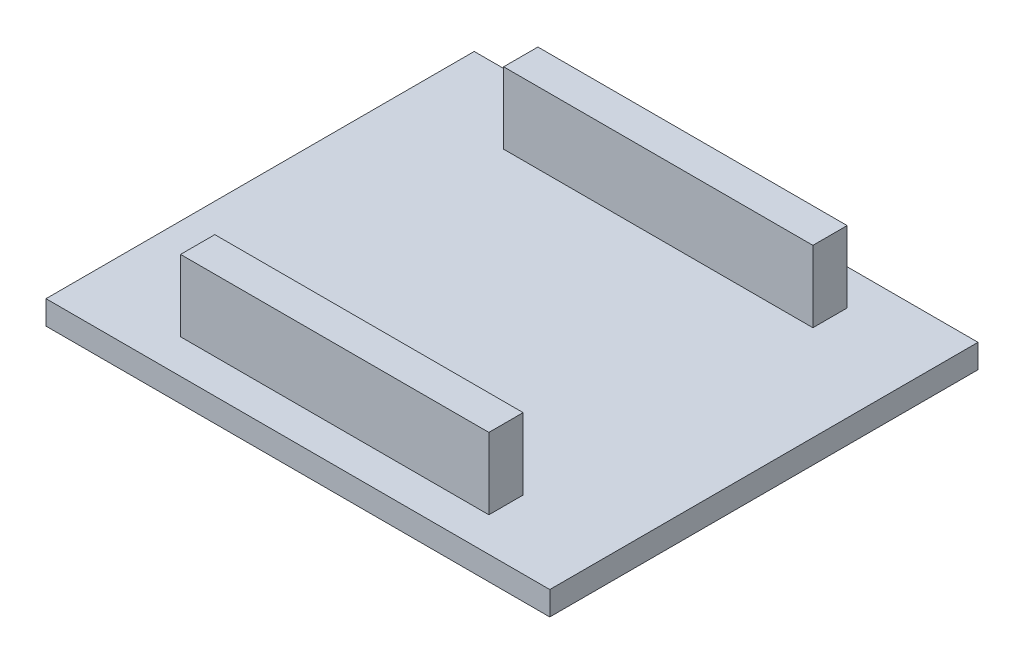
ISO-10303-21;
HEADER;
FILE_DESCRIPTION(('STEP AP214'),'2;1');
FILE_NAME('part.step','',(''),(''),'','','');
FILE_SCHEMA(('AUTOMOTIVE_DESIGN { 1 0 10303 214 1 1 1 1 }'));
ENDSEC;
DATA;
#1=APPLICATION_CONTEXT('core data for automotive mechanical design processes');
#2=APPLICATION_PROTOCOL_DEFINITION('international standard','automotive_design',2000,#1);
#3=PRODUCT_CONTEXT('',#1,'mechanical');
#4=PRODUCT('Part','Part','',(#3));
#5=PRODUCT_RELATED_PRODUCT_CATEGORY('part','',(#4));
#6=PRODUCT_DEFINITION_FORMATION('','',#4);
#7=PRODUCT_DEFINITION_CONTEXT('part definition',#1,'design');
#8=PRODUCT_DEFINITION('design','',#6,#7);
#9=PRODUCT_DEFINITION_SHAPE('','',#8);
#10=(LENGTH_UNIT() NAMED_UNIT(*) SI_UNIT(.MILLI.,.METRE.));
#11=(NAMED_UNIT(*) PLANE_ANGLE_UNIT() SI_UNIT($,.RADIAN.));
#12=(NAMED_UNIT(*) SI_UNIT($,.STERADIAN.) SOLID_ANGLE_UNIT());
#13=UNCERTAINTY_MEASURE_WITH_UNIT(LENGTH_MEASURE(1.E-05),#10,'distance_accuracy_value','');
#14=(GEOMETRIC_REPRESENTATION_CONTEXT(3) GLOBAL_UNCERTAINTY_ASSIGNED_CONTEXT((#13)) GLOBAL_UNIT_ASSIGNED_CONTEXT((#10,
#11,#12)) REPRESENTATION_CONTEXT('',''));
#15=CARTESIAN_POINT('',(0.,0.,0.));
#16=DIRECTION('',(0.,0.,1.));
#17=DIRECTION('',(1.,0.,0.));
#18=AXIS2_PLACEMENT_3D('',#15,#16,#17);
#19=CARTESIAN_POINT('',(0.,1.5875,0.));
#20=DIRECTION('',(0.,-1.,0.));
#21=DIRECTION('',(0.,0.,-1.));
#22=AXIS2_PLACEMENT_3D('',#19,#20,#21);
#23=PLANE('',#22);
#24=DIRECTION('',(0.,0.,1.));
#25=VECTOR('',#24,1.);
#26=CARTESIAN_POINT('',(6.69364701399999,1.5875,-2.286));
#27=LINE('',#26,#25);
#28=CARTESIAN_POINT('',(6.69364701399999,1.5875,-4.572));
#29=VERTEX_POINT('',#28);
#30=CARTESIAN_POINT('',(6.69364701399999,1.5875,-2.286));
#31=VERTEX_POINT('',#30);
#32=EDGE_CURVE('E148',#29,#31,#27,.T.);
#33=ORIENTED_EDGE('',*,*,#32,.F.);
#34=DIRECTION('',(-1.,0.,0.));
#35=VECTOR('',#34,1.);
#36=CARTESIAN_POINT('',(6.69364701399999,1.5875,-4.572));
#37=LINE('',#36,#35);
#38=CARTESIAN_POINT('',(27.267647014,1.5875,-4.572));
#39=VERTEX_POINT('',#38);
#40=EDGE_CURVE('E161',#39,#29,#37,.T.);
#41=ORIENTED_EDGE('',*,*,#40,.F.);
#42=DIRECTION('',(0.,0.,-1.));
#43=VECTOR('',#42,1.);
#44=CARTESIAN_POINT('',(27.267647014,1.5875,-2.286));
#45=LINE('',#44,#43);
#46=CARTESIAN_POINT('',(27.267647014,1.5875,-2.286));
#47=VERTEX_POINT('',#46);
#48=EDGE_CURVE('E170',#47,#39,#45,.T.);
#49=ORIENTED_EDGE('',*,*,#48,.F.);
#50=DIRECTION('',(1.,0.,0.));
#51=VECTOR('',#50,1.);
#52=CARTESIAN_POINT('',(6.69364701399999,1.5875,-2.286));
#53=LINE('',#52,#51);
#54=EDGE_CURVE('E151',#31,#47,#53,.T.);
#55=ORIENTED_EDGE('',*,*,#54,.F.);
#56=EDGE_LOOP('',(#33,#41,#49,#55));
#57=FACE_BOUND('',#56,.T.);
#58=DIRECTION('',(0.,0.,1.));
#59=VECTOR('',#58,1.);
#60=CARTESIAN_POINT('',(0.,1.5875,0.));
#61=LINE('',#60,#59);
#62=CARTESIAN_POINT('',(0.,1.5875,-28.575));
#63=VERTEX_POINT('',#62);
#64=CARTESIAN_POINT('',(0.,1.5875,0.));
#65=VERTEX_POINT('',#64);
#66=EDGE_CURVE('E187',#63,#65,#61,.T.);
#67=ORIENTED_EDGE('',*,*,#66,.T.);
#68=DIRECTION('',(1.,0.,0.));
#69=VECTOR('',#68,1.);
#70=CARTESIAN_POINT('',(0.,1.5875,0.));
#71=LINE('',#70,#69);
#72=CARTESIAN_POINT('',(33.617647014,1.5875,0.));
#73=VERTEX_POINT('',#72);
#74=EDGE_CURVE('E190',#65,#73,#71,.T.);
#75=ORIENTED_EDGE('',*,*,#74,.T.);
#76=DIRECTION('',(0.,0.,-1.));
#77=VECTOR('',#76,1.);
#78=CARTESIAN_POINT('',(33.617647014,1.5875,0.));
#79=LINE('',#78,#77);
#80=CARTESIAN_POINT('',(33.617647014,1.5875,-28.575));
#81=VERTEX_POINT('',#80);
#82=EDGE_CURVE('E193',#73,#81,#79,.T.);
#83=ORIENTED_EDGE('',*,*,#82,.T.);
#84=DIRECTION('',(-1.,0.,0.));
#85=VECTOR('',#84,1.);
#86=CARTESIAN_POINT('',(0.,1.5875,-28.575));
#87=LINE('',#86,#85);
#88=EDGE_CURVE('E195',#81,#63,#87,.T.);
#89=ORIENTED_EDGE('',*,*,#88,.T.);
#90=EDGE_LOOP('',(#67,#75,#83,#89));
#91=FACE_BOUND('',#90,.T.);
#92=DIRECTION('',(0.,0.,1.));
#93=VECTOR('',#92,1.);
#94=CARTESIAN_POINT('',(6.63014701399999,1.5875,-23.90775));
#95=LINE('',#94,#93);
#96=CARTESIAN_POINT('',(6.63014701399999,1.5875,-26.19375));
#97=VERTEX_POINT('',#96);
#98=CARTESIAN_POINT('',(6.63014701399999,1.5875,-23.90775));
#99=VERTEX_POINT('',#98);
#100=EDGE_CURVE('E147',#97,#99,#95,.T.);
#101=ORIENTED_EDGE('',*,*,#100,.F.);
#102=DIRECTION('',(-1.,0.,0.));
#103=VECTOR('',#102,1.);
#104=CARTESIAN_POINT('',(6.63014701399999,1.5875,-26.19375));
#105=LINE('',#104,#103);
#106=CARTESIAN_POINT('',(27.267647014,1.5875,-26.19375));
#107=VERTEX_POINT('',#106);
#108=EDGE_CURVE('E144',#107,#97,#105,.T.);
#109=ORIENTED_EDGE('',*,*,#108,.F.);
#110=DIRECTION('',(0.,0.,-1.));
#111=VECTOR('',#110,1.);
#112=CARTESIAN_POINT('',(27.267647014,1.5875,-23.90775));
#113=LINE('',#112,#111);
#114=CARTESIAN_POINT('',(27.267647014,1.5875,-23.90775));
#115=VERTEX_POINT('',#114);
#116=EDGE_CURVE('E58',#115,#107,#113,.T.);
#117=ORIENTED_EDGE('',*,*,#116,.F.);
#118=DIRECTION('',(1.,0.,0.));
#119=VECTOR('',#118,1.);
#120=CARTESIAN_POINT('',(6.63014701399999,1.5875,-23.90775));
#121=LINE('',#120,#119);
#122=EDGE_CURVE('E53',#99,#115,#121,.T.);
#123=ORIENTED_EDGE('',*,*,#122,.F.);
#124=EDGE_LOOP('',(#101,#109,#117,#123));
#125=FACE_BOUND('',#124,.T.);
#126=ADVANCED_FACE('F38',(#57,#91,#125),#23,.F.);
#127=CARTESIAN_POINT('',(0.,1.5875,0.));
#128=DIRECTION('',(1.,0.,0.));
#129=DIRECTION('',(0.,0.,-1.));
#130=AXIS2_PLACEMENT_3D('',#127,#128,#129);
#131=PLANE('',#130);
#132=DIRECTION('',(0.,0.,1.));
#133=VECTOR('',#132,1.);
#134=CARTESIAN_POINT('',(0.,0.,0.));
#135=LINE('',#134,#133);
#136=CARTESIAN_POINT('',(0.,0.,-28.575));
#137=VERTEX_POINT('',#136);
#138=CARTESIAN_POINT('',(0.,0.,0.));
#139=VERTEX_POINT('',#138);
#140=EDGE_CURVE('E186',#137,#139,#135,.T.);
#141=ORIENTED_EDGE('',*,*,#140,.T.);
#142=DIRECTION('',(0.,-1.,0.));
#143=VECTOR('',#142,1.);
#144=CARTESIAN_POINT('',(0.,1.5875,0.));
#145=LINE('',#144,#143);
#146=EDGE_CURVE('E11',#65,#139,#145,.T.);
#147=ORIENTED_EDGE('',*,*,#146,.F.);
#148=ORIENTED_EDGE('',*,*,#66,.F.);
#149=DIRECTION('',(0.,-1.,0.));
#150=VECTOR('',#149,1.);
#151=CARTESIAN_POINT('',(0.,1.5875,-28.575));
#152=LINE('',#151,#150);
#153=EDGE_CURVE('E197',#63,#137,#152,.T.);
#154=ORIENTED_EDGE('',*,*,#153,.T.);
#155=EDGE_LOOP('',(#141,#147,#148,#154));
#156=FACE_BOUND('',#155,.T.);
#157=ADVANCED_FACE('F40',(#156),#131,.F.);
#158=CARTESIAN_POINT('',(0.,1.5875,0.));
#159=DIRECTION('',(0.,0.,-1.));
#160=DIRECTION('',(-1.,0.,0.));
#161=AXIS2_PLACEMENT_3D('',#158,#159,#160);
#162=PLANE('',#161);
#163=DIRECTION('',(1.,0.,0.));
#164=VECTOR('',#163,1.);
#165=CARTESIAN_POINT('',(0.,0.,0.));
#166=LINE('',#165,#164);
#167=CARTESIAN_POINT('',(33.617647014,0.,0.));
#168=VERTEX_POINT('',#167);
#169=EDGE_CURVE('E200',#139,#168,#166,.T.);
#170=ORIENTED_EDGE('',*,*,#169,.T.);
#171=DIRECTION('',(0.,-1.,0.));
#172=VECTOR('',#171,1.);
#173=CARTESIAN_POINT('',(33.617647014,1.5875,0.));
#174=LINE('',#173,#172);
#175=EDGE_CURVE('E46',#73,#168,#174,.T.);
#176=ORIENTED_EDGE('',*,*,#175,.F.);
#177=ORIENTED_EDGE('',*,*,#74,.F.);
#178=ORIENTED_EDGE('',*,*,#146,.T.);
#179=EDGE_LOOP('',(#170,#176,#177,#178));
#180=FACE_BOUND('',#179,.T.);
#181=ADVANCED_FACE('F229',(#180),#162,.F.);
#182=CARTESIAN_POINT('',(33.617647014,1.5875,0.));
#183=DIRECTION('',(-1.,0.,0.));
#184=DIRECTION('',(0.,0.,1.));
#185=AXIS2_PLACEMENT_3D('',#182,#183,#184);
#186=PLANE('',#185);
#187=DIRECTION('',(0.,0.,-1.));
#188=VECTOR('',#187,1.);
#189=CARTESIAN_POINT('',(33.617647014,0.,0.));
#190=LINE('',#189,#188);
#191=CARTESIAN_POINT('',(33.617647014,0.,-28.575));
#192=VERTEX_POINT('',#191);
#193=EDGE_CURVE('E202',#168,#192,#190,.T.);
#194=ORIENTED_EDGE('',*,*,#193,.T.);
#195=DIRECTION('',(0.,-1.,0.));
#196=VECTOR('',#195,1.);
#197=CARTESIAN_POINT('',(33.617647014,1.5875,-28.575));
#198=LINE('',#197,#196);
#199=EDGE_CURVE('E207',#81,#192,#198,.T.);
#200=ORIENTED_EDGE('',*,*,#199,.F.);
#201=ORIENTED_EDGE('',*,*,#82,.F.);
#202=ORIENTED_EDGE('',*,*,#175,.T.);
#203=EDGE_LOOP('',(#194,#200,#201,#202));
#204=FACE_BOUND('',#203,.T.);
#205=ADVANCED_FACE('F214',(#204),#186,.F.);
#206=CARTESIAN_POINT('',(0.,1.5875,-28.575));
#207=DIRECTION('',(0.,0.,1.));
#208=DIRECTION('',(1.,0.,0.));
#209=AXIS2_PLACEMENT_3D('',#206,#207,#208);
#210=PLANE('',#209);
#211=DIRECTION('',(-1.,0.,0.));
#212=VECTOR('',#211,1.);
#213=CARTESIAN_POINT('',(0.,0.,-28.575));
#214=LINE('',#213,#212);
#215=EDGE_CURVE('E191',#192,#137,#214,.T.);
#216=ORIENTED_EDGE('',*,*,#215,.T.);
#217=ORIENTED_EDGE('',*,*,#153,.F.);
#218=ORIENTED_EDGE('',*,*,#88,.F.);
#219=ORIENTED_EDGE('',*,*,#199,.T.);
#220=EDGE_LOOP('',(#216,#217,#218,#219));
#221=FACE_BOUND('',#220,.T.);
#222=ADVANCED_FACE('F223',(#221),#210,.F.);
#223=CARTESIAN_POINT('',(0.,0.,0.));
#224=DIRECTION('',(0.,-1.,0.));
#225=DIRECTION('',(0.,0.,-1.));
#226=AXIS2_PLACEMENT_3D('',#223,#224,#225);
#227=PLANE('',#226);
#228=ORIENTED_EDGE('',*,*,#140,.F.);
#229=ORIENTED_EDGE('',*,*,#215,.F.);
#230=ORIENTED_EDGE('',*,*,#193,.F.);
#231=ORIENTED_EDGE('',*,*,#169,.F.);
#232=EDGE_LOOP('',(#228,#229,#230,#231));
#233=FACE_BOUND('',#232,.T.);
#234=ADVANCED_FACE('F220',(#233),#227,.T.);
#235=CARTESIAN_POINT('',(6.69364701399999,6.35,-2.286));
#236=DIRECTION('',(1.,0.,0.));
#237=DIRECTION('',(0.,0.,-1.));
#238=AXIS2_PLACEMENT_3D('',#235,#236,#237);
#239=PLANE('',#238);
#240=ORIENTED_EDGE('',*,*,#32,.T.);
#241=DIRECTION('',(0.,-1.,0.));
#242=VECTOR('',#241,1.);
#243=CARTESIAN_POINT('',(6.69364701399999,6.35,-2.286));
#244=LINE('',#243,#242);
#245=CARTESIAN_POINT('',(6.69364701399999,6.35,-2.286));
#246=VERTEX_POINT('',#245);
#247=EDGE_CURVE('E183',#246,#31,#244,.T.);
#248=ORIENTED_EDGE('',*,*,#247,.F.);
#249=DIRECTION('',(0.,0.,1.));
#250=VECTOR('',#249,1.);
#251=CARTESIAN_POINT('',(6.69364701399999,6.35,-2.286));
#252=LINE('',#251,#250);
#253=CARTESIAN_POINT('',(6.69364701399999,6.35,-4.572));
#254=VERTEX_POINT('',#253);
#255=EDGE_CURVE('E157',#254,#246,#252,.T.);
#256=ORIENTED_EDGE('',*,*,#255,.F.);
#257=DIRECTION('',(0.,-1.,0.));
#258=VECTOR('',#257,1.);
#259=CARTESIAN_POINT('',(6.69364701399999,6.35,-4.572));
#260=LINE('',#259,#258);
#261=EDGE_CURVE('E166',#254,#29,#260,.T.);
#262=ORIENTED_EDGE('',*,*,#261,.T.);
#263=EDGE_LOOP('',(#240,#248,#256,#262));
#264=FACE_BOUND('',#263,.T.);
#265=ADVANCED_FACE('F243',(#264),#239,.F.);
#266=CARTESIAN_POINT('',(6.69364701399999,6.35,-2.286));
#267=DIRECTION('',(0.,0.,-1.));
#268=DIRECTION('',(-1.,0.,0.));
#269=AXIS2_PLACEMENT_3D('',#266,#267,#268);
#270=PLANE('',#269);
#271=ORIENTED_EDGE('',*,*,#54,.T.);
#272=DIRECTION('',(0.,-1.,0.));
#273=VECTOR('',#272,1.);
#274=CARTESIAN_POINT('',(27.267647014,6.35,-2.286));
#275=LINE('',#274,#273);
#276=CARTESIAN_POINT('',(27.267647014,6.35,-2.286));
#277=VERTEX_POINT('',#276);
#278=EDGE_CURVE('E180',#277,#47,#275,.T.);
#279=ORIENTED_EDGE('',*,*,#278,.F.);
#280=DIRECTION('',(1.,0.,0.));
#281=VECTOR('',#280,1.);
#282=CARTESIAN_POINT('',(6.69364701399999,6.35,-2.286));
#283=LINE('',#282,#281);
#284=EDGE_CURVE('E160',#246,#277,#283,.T.);
#285=ORIENTED_EDGE('',*,*,#284,.F.);
#286=ORIENTED_EDGE('',*,*,#247,.T.);
#287=EDGE_LOOP('',(#271,#279,#285,#286));
#288=FACE_BOUND('',#287,.T.);
#289=ADVANCED_FACE('F262',(#288),#270,.F.);
#290=CARTESIAN_POINT('',(27.267647014,6.35,-2.286));
#291=DIRECTION('',(-1.,0.,0.));
#292=DIRECTION('',(0.,0.,1.));
#293=AXIS2_PLACEMENT_3D('',#290,#291,#292);
#294=PLANE('',#293);
#295=ORIENTED_EDGE('',*,*,#48,.T.);
#296=DIRECTION('',(0.,-1.,0.));
#297=VECTOR('',#296,1.);
#298=CARTESIAN_POINT('',(27.267647014,6.35,-4.572));
#299=LINE('',#298,#297);
#300=CARTESIAN_POINT('',(27.267647014,6.35,-4.572));
#301=VERTEX_POINT('',#300);
#302=EDGE_CURVE('E177',#301,#39,#299,.T.);
#303=ORIENTED_EDGE('',*,*,#302,.F.);
#304=DIRECTION('',(0.,0.,-1.));
#305=VECTOR('',#304,1.);
#306=CARTESIAN_POINT('',(27.267647014,6.35,-2.286));
#307=LINE('',#306,#305);
#308=EDGE_CURVE('E163',#277,#301,#307,.T.);
#309=ORIENTED_EDGE('',*,*,#308,.F.);
#310=ORIENTED_EDGE('',*,*,#278,.T.);
#311=EDGE_LOOP('',(#295,#303,#309,#310));
#312=FACE_BOUND('',#311,.T.);
#313=ADVANCED_FACE('F269',(#312),#294,.F.);
#314=CARTESIAN_POINT('',(6.69364701399999,6.35,-4.572));
#315=DIRECTION('',(0.,0.,1.));
#316=DIRECTION('',(1.,0.,0.));
#317=AXIS2_PLACEMENT_3D('',#314,#315,#316);
#318=PLANE('',#317);
#319=ORIENTED_EDGE('',*,*,#40,.T.);
#320=ORIENTED_EDGE('',*,*,#261,.F.);
#321=DIRECTION('',(-1.,0.,0.));
#322=VECTOR('',#321,1.);
#323=CARTESIAN_POINT('',(6.69364701399999,6.35,-4.572));
#324=LINE('',#323,#322);
#325=EDGE_CURVE('E165',#301,#254,#324,.T.);
#326=ORIENTED_EDGE('',*,*,#325,.F.);
#327=ORIENTED_EDGE('',*,*,#302,.T.);
#328=EDGE_LOOP('',(#319,#320,#326,#327));
#329=FACE_BOUND('',#328,.T.);
#330=ADVANCED_FACE('F276',(#329),#318,.F.);
#331=CARTESIAN_POINT('',(0.,6.35,0.));
#332=DIRECTION('',(0.,-1.,0.));
#333=DIRECTION('',(0.,0.,-1.));
#334=AXIS2_PLACEMENT_3D('',#331,#332,#333);
#335=PLANE('',#334);
#336=ORIENTED_EDGE('',*,*,#255,.T.);
#337=ORIENTED_EDGE('',*,*,#284,.T.);
#338=ORIENTED_EDGE('',*,*,#308,.T.);
#339=ORIENTED_EDGE('',*,*,#325,.T.);
#340=EDGE_LOOP('',(#336,#337,#338,#339));
#341=FACE_BOUND('',#340,.T.);
#342=ADVANCED_FACE('F284',(#341),#335,.F.);
#343=CARTESIAN_POINT('',(6.63014701399999,6.35,-23.90775));
#344=DIRECTION('',(1.,0.,0.));
#345=DIRECTION('',(0.,0.,-1.));
#346=AXIS2_PLACEMENT_3D('',#343,#344,#345);
#347=PLANE('',#346);
#348=ORIENTED_EDGE('',*,*,#100,.T.);
#349=DIRECTION('',(0.,-1.,0.));
#350=VECTOR('',#349,1.);
#351=CARTESIAN_POINT('',(6.63014701399999,6.35,-23.90775));
#352=LINE('',#351,#350);
#353=CARTESIAN_POINT('',(6.63014701399999,6.35,-23.90775));
#354=VERTEX_POINT('',#353);
#355=EDGE_CURVE('E128',#354,#99,#352,.T.);
#356=ORIENTED_EDGE('',*,*,#355,.F.);
#357=DIRECTION('',(0.,0.,1.));
#358=VECTOR('',#357,1.);
#359=CARTESIAN_POINT('',(6.63014701399999,6.35,-23.90775));
#360=LINE('',#359,#358);
#361=CARTESIAN_POINT('',(6.63014701399999,6.35,-26.19375));
#362=VERTEX_POINT('',#361);
#363=EDGE_CURVE('E135',#362,#354,#360,.T.);
#364=ORIENTED_EDGE('',*,*,#363,.F.);
#365=DIRECTION('',(0.,-1.,0.));
#366=VECTOR('',#365,1.);
#367=CARTESIAN_POINT('',(6.63014701399999,6.35,-26.19375));
#368=LINE('',#367,#366);
#369=EDGE_CURVE('E373',#362,#97,#368,.T.);
#370=ORIENTED_EDGE('',*,*,#369,.T.);
#371=EDGE_LOOP('',(#348,#356,#364,#370));
#372=FACE_BOUND('',#371,.T.);
#373=ADVANCED_FACE('F146',(#372),#347,.F.);
#374=CARTESIAN_POINT('',(6.63014701399999,6.35,-23.90775));
#375=DIRECTION('',(0.,0.,-1.));
#376=DIRECTION('',(-1.,0.,0.));
#377=AXIS2_PLACEMENT_3D('',#374,#375,#376);
#378=PLANE('',#377);
#379=ORIENTED_EDGE('',*,*,#122,.T.);
#380=DIRECTION('',(0.,-1.,0.));
#381=VECTOR('',#380,1.);
#382=CARTESIAN_POINT('',(27.267647014,6.35,-23.90775));
#383=LINE('',#382,#381);
#384=CARTESIAN_POINT('',(27.267647014,6.35,-23.90775));
#385=VERTEX_POINT('',#384);
#386=EDGE_CURVE('E131',#385,#115,#383,.T.);
#387=ORIENTED_EDGE('',*,*,#386,.F.);
#388=DIRECTION('',(1.,0.,0.));
#389=VECTOR('',#388,1.);
#390=CARTESIAN_POINT('',(6.63014701399999,6.35,-23.90775));
#391=LINE('',#390,#389);
#392=EDGE_CURVE('E124',#354,#385,#391,.T.);
#393=ORIENTED_EDGE('',*,*,#392,.F.);
#394=ORIENTED_EDGE('',*,*,#355,.T.);
#395=EDGE_LOOP('',(#379,#387,#393,#394));
#396=FACE_BOUND('',#395,.T.);
#397=ADVANCED_FACE('F126',(#396),#378,.F.);
#398=CARTESIAN_POINT('',(27.267647014,6.35,-23.90775));
#399=DIRECTION('',(-1.,0.,0.));
#400=DIRECTION('',(0.,0.,1.));
#401=AXIS2_PLACEMENT_3D('',#398,#399,#400);
#402=PLANE('',#401);
#403=ORIENTED_EDGE('',*,*,#116,.T.);
#404=DIRECTION('',(0.,-1.,0.));
#405=VECTOR('',#404,1.);
#406=CARTESIAN_POINT('',(27.267647014,6.35,-26.19375));
#407=LINE('',#406,#405);
#408=CARTESIAN_POINT('',(27.267647014,6.35,-26.19375));
#409=VERTEX_POINT('',#408);
#410=EDGE_CURVE('E153',#409,#107,#407,.T.);
#411=ORIENTED_EDGE('',*,*,#410,.F.);
#412=DIRECTION('',(0.,0.,-1.));
#413=VECTOR('',#412,1.);
#414=CARTESIAN_POINT('',(27.267647014,6.35,-23.90775));
#415=LINE('',#414,#413);
#416=EDGE_CURVE('E134',#385,#409,#415,.T.);
#417=ORIENTED_EDGE('',*,*,#416,.F.);
#418=ORIENTED_EDGE('',*,*,#386,.T.);
#419=EDGE_LOOP('',(#403,#411,#417,#418));
#420=FACE_BOUND('',#419,.T.);
#421=ADVANCED_FACE('F305',(#420),#402,.F.);
#422=CARTESIAN_POINT('',(6.63014701399999,6.35,-26.19375));
#423=DIRECTION('',(0.,0.,1.));
#424=DIRECTION('',(1.,0.,0.));
#425=AXIS2_PLACEMENT_3D('',#422,#423,#424);
#426=PLANE('',#425);
#427=ORIENTED_EDGE('',*,*,#108,.T.);
#428=ORIENTED_EDGE('',*,*,#369,.F.);
#429=DIRECTION('',(-1.,0.,0.));
#430=VECTOR('',#429,1.);
#431=CARTESIAN_POINT('',(6.63014701399999,6.35,-26.19375));
#432=LINE('',#431,#430);
#433=EDGE_CURVE('E140',#409,#362,#432,.T.);
#434=ORIENTED_EDGE('',*,*,#433,.F.);
#435=ORIENTED_EDGE('',*,*,#410,.T.);
#436=EDGE_LOOP('',(#427,#428,#434,#435));
#437=FACE_BOUND('',#436,.T.);
#438=ADVANCED_FACE('F312',(#437),#426,.F.);
#439=CARTESIAN_POINT('',(0.,6.35,0.));
#440=DIRECTION('',(0.,-1.,0.));
#441=DIRECTION('',(0.,0.,-1.));
#442=AXIS2_PLACEMENT_3D('',#439,#440,#441);
#443=PLANE('',#442);
#444=ORIENTED_EDGE('',*,*,#363,.T.);
#445=ORIENTED_EDGE('',*,*,#392,.T.);
#446=ORIENTED_EDGE('',*,*,#416,.T.);
#447=ORIENTED_EDGE('',*,*,#433,.T.);
#448=EDGE_LOOP('',(#444,#445,#446,#447));
#449=FACE_BOUND('',#448,.T.);
#450=ADVANCED_FACE('F138',(#449),#443,.F.);
#451=CLOSED_SHELL('',(#126,#157,#181,#205,#222,#234,#265,#289,#313,#330,#342,#373,#397,#421,
#438,#450));
#452=MANIFOLD_SOLID_BREP('B2',#451);
#453=ADVANCED_BREP_SHAPE_REPRESENTATION('',(#18,#452),#14);
#454=SHAPE_DEFINITION_REPRESENTATION(#9,#453);
ENDSEC;
END-ISO-10303-21;
